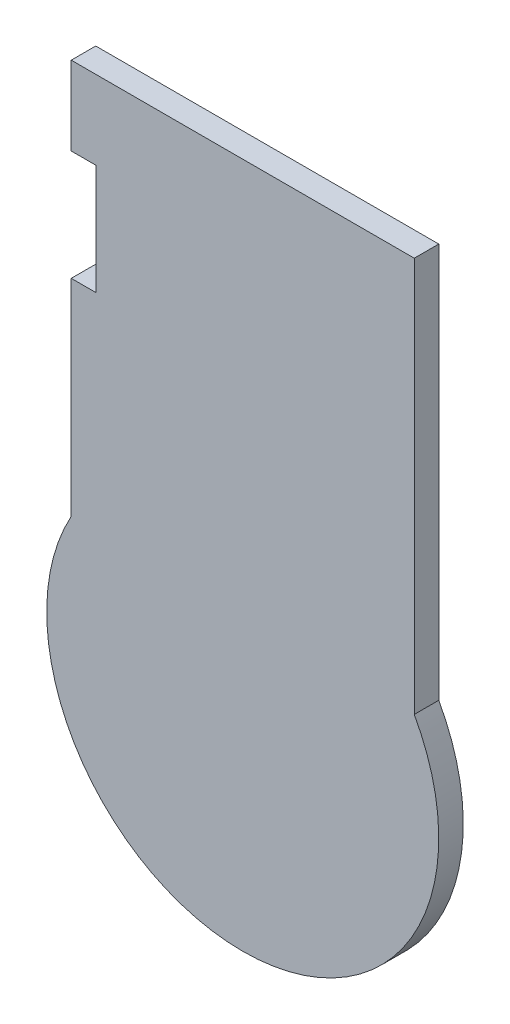
ISO-10303-21;
HEADER;
FILE_DESCRIPTION(('STEP AP214'),'2;1');
FILE_NAME('part.step','',(''),(''),'','','');
FILE_SCHEMA(('AUTOMOTIVE_DESIGN { 1 0 10303 214 1 1 1 1 }'));
ENDSEC;
DATA;
#1=APPLICATION_CONTEXT('core data for automotive mechanical design processes');
#2=APPLICATION_PROTOCOL_DEFINITION('international standard','automotive_design',2000,#1);
#3=PRODUCT_CONTEXT('',#1,'mechanical');
#4=PRODUCT('Part','Part','',(#3));
#5=PRODUCT_RELATED_PRODUCT_CATEGORY('part','',(#4));
#6=PRODUCT_DEFINITION_FORMATION('','',#4);
#7=PRODUCT_DEFINITION_CONTEXT('part definition',#1,'design');
#8=PRODUCT_DEFINITION('design','',#6,#7);
#9=PRODUCT_DEFINITION_SHAPE('','',#8);
#10=(LENGTH_UNIT() NAMED_UNIT(*) SI_UNIT(.MILLI.,.METRE.));
#11=(NAMED_UNIT(*) PLANE_ANGLE_UNIT() SI_UNIT($,.RADIAN.));
#12=(NAMED_UNIT(*) SI_UNIT($,.STERADIAN.) SOLID_ANGLE_UNIT());
#13=UNCERTAINTY_MEASURE_WITH_UNIT(LENGTH_MEASURE(1.E-05),#10,'distance_accuracy_value','');
#14=(GEOMETRIC_REPRESENTATION_CONTEXT(3) GLOBAL_UNCERTAINTY_ASSIGNED_CONTEXT((#13)) GLOBAL_UNIT_ASSIGNED_CONTEXT((#10,
#11,#12)) REPRESENTATION_CONTEXT('',''));
#15=CARTESIAN_POINT('',(0.,0.,0.));
#16=DIRECTION('',(0.,0.,1.));
#17=DIRECTION('',(1.,0.,0.));
#18=AXIS2_PLACEMENT_3D('',#15,#16,#17);
#19=CARTESIAN_POINT('',(-35.,100.,5.));
#20=DIRECTION('',(1.,0.,0.));
#21=DIRECTION('',(0.,1.,0.));
#22=AXIS2_PLACEMENT_3D('',#19,#20,#21);
#23=PLANE('',#22);
#24=DIRECTION('',(0.,-1.,0.));
#25=VECTOR('',#24,1.);
#26=CARTESIAN_POINT('',(-35.,100.,0.));
#27=LINE('',#26,#25);
#28=CARTESIAN_POINT('',(-35.,100.,0.));
#29=VERTEX_POINT('',#28);
#30=CARTESIAN_POINT('',(-35.,83.9398026836958,0.));
#31=VERTEX_POINT('',#30);
#32=EDGE_CURVE('E156',#29,#31,#27,.T.);
#33=ORIENTED_EDGE('',*,*,#32,.T.);
#34=DIRECTION('',(0.,0.,1.));
#35=VECTOR('',#34,1.);
#36=CARTESIAN_POINT('',(-35.,83.9398026836958,5.));
#37=LINE('',#36,#35);
#38=CARTESIAN_POINT('',(-35.,83.9398026836958,5.));
#39=VERTEX_POINT('',#38);
#40=EDGE_CURVE('E123',#31,#39,#37,.T.);
#41=ORIENTED_EDGE('',*,*,#40,.T.);
#42=DIRECTION('',(0.,-1.,0.));
#43=VECTOR('',#42,1.);
#44=CARTESIAN_POINT('',(-35.,100.,5.));
#45=LINE('',#44,#43);
#46=CARTESIAN_POINT('',(-35.,100.,5.));
#47=VERTEX_POINT('',#46);
#48=EDGE_CURVE('E146',#47,#39,#45,.T.);
#49=ORIENTED_EDGE('',*,*,#48,.F.);
#50=DIRECTION('',(0.,0.,-1.));
#51=VECTOR('',#50,1.);
#52=CARTESIAN_POINT('',(-35.,100.,5.));
#53=LINE('',#52,#51);
#54=EDGE_CURVE('E162',#47,#29,#53,.T.);
#55=ORIENTED_EDGE('',*,*,#54,.T.);
#56=EDGE_LOOP('',(#33,#41,#49,#55));
#57=FACE_BOUND('',#56,.T.);
#58=ADVANCED_FACE('F35',(#57),#23,.F.);
#59=CARTESIAN_POINT('',(35.,100.,5.));
#60=DIRECTION('',(-1.,0.,0.));
#61=DIRECTION('',(0.,-1.,0.));
#62=AXIS2_PLACEMENT_3D('',#59,#60,#61);
#63=PLANE('',#62);
#64=DIRECTION('',(0.,1.,0.));
#65=VECTOR('',#64,1.);
#66=CARTESIAN_POINT('',(35.,100.,0.));
#67=LINE('',#66,#65);
#68=CARTESIAN_POINT('',(35.,19.3649167310371,0.));
#69=VERTEX_POINT('',#68);
#70=CARTESIAN_POINT('',(35.,100.,0.));
#71=VERTEX_POINT('',#70);
#72=EDGE_CURVE('E141',#69,#71,#67,.T.);
#73=ORIENTED_EDGE('',*,*,#72,.T.);
#74=DIRECTION('',(0.,0.,-1.));
#75=VECTOR('',#74,1.);
#76=CARTESIAN_POINT('',(35.,100.,5.));
#77=LINE('',#76,#75);
#78=CARTESIAN_POINT('',(35.,100.,5.));
#79=VERTEX_POINT('',#78);
#80=EDGE_CURVE('E43',#79,#71,#77,.T.);
#81=ORIENTED_EDGE('',*,*,#80,.F.);
#82=DIRECTION('',(0.,1.,0.));
#83=VECTOR('',#82,1.);
#84=CARTESIAN_POINT('',(35.,100.,5.));
#85=LINE('',#84,#83);
#86=CARTESIAN_POINT('',(35.,19.3649167310371,5.));
#87=VERTEX_POINT('',#86);
#88=EDGE_CURVE('E142',#87,#79,#85,.T.);
#89=ORIENTED_EDGE('',*,*,#88,.F.);
#90=DIRECTION('',(0.,0.,-1.));
#91=VECTOR('',#90,1.);
#92=CARTESIAN_POINT('',(35.,19.3649167310371,5.));
#93=LINE('',#92,#91);
#94=EDGE_CURVE('E150',#87,#69,#93,.T.);
#95=ORIENTED_EDGE('',*,*,#94,.T.);
#96=EDGE_LOOP('',(#73,#81,#89,#95));
#97=FACE_BOUND('',#96,.T.);
#98=ADVANCED_FACE('F37',(#97),#63,.F.);
#99=CARTESIAN_POINT('',(35.,100.,5.));
#100=DIRECTION('',(0.,-1.,0.));
#101=DIRECTION('',(0.,0.,-1.));
#102=AXIS2_PLACEMENT_3D('',#99,#100,#101);
#103=PLANE('',#102);
#104=DIRECTION('',(-1.,0.,0.));
#105=VECTOR('',#104,1.);
#106=CARTESIAN_POINT('',(35.,100.,0.));
#107=LINE('',#106,#105);
#108=EDGE_CURVE('E153',#71,#29,#107,.T.);
#109=ORIENTED_EDGE('',*,*,#108,.T.);
#110=ORIENTED_EDGE('',*,*,#54,.F.);
#111=DIRECTION('',(-1.,0.,0.));
#112=VECTOR('',#111,1.);
#113=CARTESIAN_POINT('',(35.,100.,5.));
#114=LINE('',#113,#112);
#115=EDGE_CURVE('E88',#79,#47,#114,.T.);
#116=ORIENTED_EDGE('',*,*,#115,.F.);
#117=ORIENTED_EDGE('',*,*,#80,.T.);
#118=EDGE_LOOP('',(#109,#110,#116,#117));
#119=FACE_BOUND('',#118,.T.);
#120=ADVANCED_FACE('F165',(#119),#103,.F.);
#121=CARTESIAN_POINT('',(-35.,61.4398026836958,5.));
#122=VERTEX_POINT('',#121);
#123=CARTESIAN_POINT('',(-35.,19.3649167310371,5.));
#124=VERTEX_POINT('',#123);
#125=EDGE_CURVE('E145',#122,#124,#45,.T.);
#126=ORIENTED_EDGE('',*,*,#125,.F.);
#127=DIRECTION('',(0.,0.,-1.));
#128=VECTOR('',#127,1.);
#129=CARTESIAN_POINT('',(-35.,61.4398026836958,5.));
#130=LINE('',#129,#128);
#131=CARTESIAN_POINT('',(-35.,61.4398026836958,0.));
#132=VERTEX_POINT('',#131);
#133=EDGE_CURVE('E116',#122,#132,#130,.T.);
#134=ORIENTED_EDGE('',*,*,#133,.T.);
#135=CARTESIAN_POINT('',(-35.,19.3649167310371,0.));
#136=VERTEX_POINT('',#135);
#137=EDGE_CURVE('E155',#132,#136,#27,.T.);
#138=ORIENTED_EDGE('',*,*,#137,.T.);
#139=DIRECTION('',(0.,0.,-1.));
#140=VECTOR('',#139,1.);
#141=CARTESIAN_POINT('',(-35.,19.3649167310371,5.));
#142=LINE('',#141,#140);
#143=EDGE_CURVE('E160',#124,#136,#142,.T.);
#144=ORIENTED_EDGE('',*,*,#143,.F.);
#145=EDGE_LOOP('',(#126,#134,#138,#144));
#146=FACE_BOUND('',#145,.T.);
#147=ADVANCED_FACE('F177',(#146),#23,.F.);
#148=CARTESIAN_POINT('',(0.,0.,5.));
#149=DIRECTION('',(0.,0.,-1.));
#150=DIRECTION('',(-1.,0.,0.));
#151=AXIS2_PLACEMENT_3D('',#148,#149,#150);
#152=CYLINDRICAL_SURFACE('',#151,40.);
#153=CARTESIAN_POINT('',(0.,0.,0.));
#154=DIRECTION('',(0.,0.,1.));
#155=DIRECTION('',(1.,0.,0.));
#156=AXIS2_PLACEMENT_3D('',#153,#154,#155);
#157=CIRCLE('',#156,40.);
#158=EDGE_CURVE('E80',#136,#69,#157,.T.);
#159=ORIENTED_EDGE('',*,*,#158,.T.);
#160=ORIENTED_EDGE('',*,*,#94,.F.);
#161=CARTESIAN_POINT('',(0.,0.,5.));
#162=DIRECTION('',(0.,0.,1.));
#163=DIRECTION('',(1.,0.,0.));
#164=AXIS2_PLACEMENT_3D('',#161,#162,#163);
#165=CIRCLE('',#164,40.);
#166=EDGE_CURVE('E59',#124,#87,#165,.T.);
#167=ORIENTED_EDGE('',*,*,#166,.F.);
#168=ORIENTED_EDGE('',*,*,#143,.T.);
#169=EDGE_LOOP('',(#159,#160,#167,#168));
#170=FACE_BOUND('',#169,.T.);
#171=ADVANCED_FACE('F178',(#170),#152,.T.);
#172=CARTESIAN_POINT('',(0.,0.,5.));
#173=DIRECTION('',(0.,0.,1.));
#174=DIRECTION('',(1.,0.,0.));
#175=AXIS2_PLACEMENT_3D('',#172,#173,#174);
#176=PLANE('',#175);
#177=DIRECTION('',(-1.,0.,0.));
#178=VECTOR('',#177,1.);
#179=CARTESIAN_POINT('',(-29.9,83.9398026836958,5.));
#180=LINE('',#179,#178);
#181=CARTESIAN_POINT('',(-29.9,83.9398026836958,5.));
#182=VERTEX_POINT('',#181);
#183=EDGE_CURVE('E130',#182,#39,#180,.T.);
#184=ORIENTED_EDGE('',*,*,#183,.F.);
#185=DIRECTION('',(0.,1.,0.));
#186=VECTOR('',#185,1.);
#187=CARTESIAN_POINT('',(-29.9,61.4398026836958,5.));
#188=LINE('',#187,#186);
#189=CARTESIAN_POINT('',(-29.9,61.4398026836958,5.));
#190=VERTEX_POINT('',#189);
#191=EDGE_CURVE('E113',#190,#182,#188,.T.);
#192=ORIENTED_EDGE('',*,*,#191,.F.);
#193=DIRECTION('',(1.,0.,0.));
#194=VECTOR('',#193,1.);
#195=CARTESIAN_POINT('',(-29.9,61.4398026836958,5.));
#196=LINE('',#195,#194);
#197=EDGE_CURVE('E134',#122,#190,#196,.T.);
#198=ORIENTED_EDGE('',*,*,#197,.F.);
#199=ORIENTED_EDGE('',*,*,#125,.T.);
#200=ORIENTED_EDGE('',*,*,#166,.T.);
#201=ORIENTED_EDGE('',*,*,#88,.T.);
#202=ORIENTED_EDGE('',*,*,#115,.T.);
#203=ORIENTED_EDGE('',*,*,#48,.T.);
#204=EDGE_LOOP('',(#184,#192,#198,#199,#200,#201,#202,#203));
#205=FACE_BOUND('',#204,.T.);
#206=ADVANCED_FACE('F171',(#205),#176,.T.);
#207=CARTESIAN_POINT('',(0.,0.,0.));
#208=DIRECTION('',(0.,0.,1.));
#209=DIRECTION('',(1.,0.,0.));
#210=AXIS2_PLACEMENT_3D('',#207,#208,#209);
#211=PLANE('',#210);
#212=DIRECTION('',(0.,1.,0.));
#213=VECTOR('',#212,1.);
#214=CARTESIAN_POINT('',(-29.9,61.4398026836958,0.));
#215=LINE('',#214,#213);
#216=CARTESIAN_POINT('',(-29.9,61.4398026836958,0.));
#217=VERTEX_POINT('',#216);
#218=CARTESIAN_POINT('',(-29.9,83.9398026836958,0.));
#219=VERTEX_POINT('',#218);
#220=EDGE_CURVE('E50',#217,#219,#215,.T.);
#221=ORIENTED_EDGE('',*,*,#220,.T.);
#222=DIRECTION('',(-1.,0.,0.));
#223=VECTOR('',#222,1.);
#224=CARTESIAN_POINT('',(-29.9,83.9398026836958,0.));
#225=LINE('',#224,#223);
#226=EDGE_CURVE('E120',#219,#31,#225,.T.);
#227=ORIENTED_EDGE('',*,*,#226,.T.);
#228=ORIENTED_EDGE('',*,*,#32,.F.);
#229=ORIENTED_EDGE('',*,*,#108,.F.);
#230=ORIENTED_EDGE('',*,*,#72,.F.);
#231=ORIENTED_EDGE('',*,*,#158,.F.);
#232=ORIENTED_EDGE('',*,*,#137,.F.);
#233=DIRECTION('',(1.,0.,0.));
#234=VECTOR('',#233,1.);
#235=CARTESIAN_POINT('',(0.,61.4398026836958,0.));
#236=LINE('',#235,#234);
#237=EDGE_CURVE('E11',#132,#217,#236,.T.);
#238=ORIENTED_EDGE('',*,*,#237,.T.);
#239=EDGE_LOOP('',(#221,#227,#228,#229,#230,#231,#232,#238));
#240=FACE_BOUND('',#239,.T.);
#241=ADVANCED_FACE('F128',(#240),#211,.F.);
#242=CARTESIAN_POINT('',(-29.9,83.9398026836958,0.));
#243=DIRECTION('',(0.,1.,0.));
#244=DIRECTION('',(0.,0.,1.));
#245=AXIS2_PLACEMENT_3D('',#242,#243,#244);
#246=PLANE('',#245);
#247=ORIENTED_EDGE('',*,*,#226,.F.);
#248=DIRECTION('',(0.,0.,1.));
#249=VECTOR('',#248,1.);
#250=CARTESIAN_POINT('',(-29.9,83.9398026836958,0.));
#251=LINE('',#250,#249);
#252=EDGE_CURVE('E109',#219,#182,#251,.T.);
#253=ORIENTED_EDGE('',*,*,#252,.T.);
#254=ORIENTED_EDGE('',*,*,#183,.T.);
#255=ORIENTED_EDGE('',*,*,#40,.F.);
#256=EDGE_LOOP('',(#247,#253,#254,#255));
#257=FACE_BOUND('',#256,.T.);
#258=ADVANCED_FACE('F121',(#257),#246,.F.);
#259=CARTESIAN_POINT('',(-29.9,61.4398026836958,0.));
#260=DIRECTION('',(0.,-1.,0.));
#261=DIRECTION('',(0.,0.,-1.));
#262=AXIS2_PLACEMENT_3D('',#259,#260,#261);
#263=PLANE('',#262);
#264=ORIENTED_EDGE('',*,*,#197,.T.);
#265=DIRECTION('',(0.,0.,1.));
#266=VECTOR('',#265,1.);
#267=CARTESIAN_POINT('',(-29.9,61.4398026836958,0.));
#268=LINE('',#267,#266);
#269=EDGE_CURVE('E117',#217,#190,#268,.T.);
#270=ORIENTED_EDGE('',*,*,#269,.F.);
#271=ORIENTED_EDGE('',*,*,#237,.F.);
#272=ORIENTED_EDGE('',*,*,#133,.F.);
#273=EDGE_LOOP('',(#264,#270,#271,#272));
#274=FACE_BOUND('',#273,.T.);
#275=ADVANCED_FACE('F226',(#274),#263,.F.);
#276=CARTESIAN_POINT('',(-29.9,61.4398026836958,0.));
#277=DIRECTION('',(1.,0.,0.));
#278=DIRECTION('',(0.,0.,-1.));
#279=AXIS2_PLACEMENT_3D('',#276,#277,#278);
#280=PLANE('',#279);
#281=ORIENTED_EDGE('',*,*,#191,.T.);
#282=ORIENTED_EDGE('',*,*,#252,.F.);
#283=ORIENTED_EDGE('',*,*,#220,.F.);
#284=ORIENTED_EDGE('',*,*,#269,.T.);
#285=EDGE_LOOP('',(#281,#282,#283,#284));
#286=FACE_BOUND('',#285,.T.);
#287=ADVANCED_FACE('F111',(#286),#280,.F.);
#288=CLOSED_SHELL('',(#58,#98,#120,#147,#171,#206,#241,#258,#275,#287));
#289=MANIFOLD_SOLID_BREP('B2',#288);
#290=ADVANCED_BREP_SHAPE_REPRESENTATION('',(#18,#289),#14);
#291=SHAPE_DEFINITION_REPRESENTATION(#9,#290);
ENDSEC;
END-ISO-10303-21;
